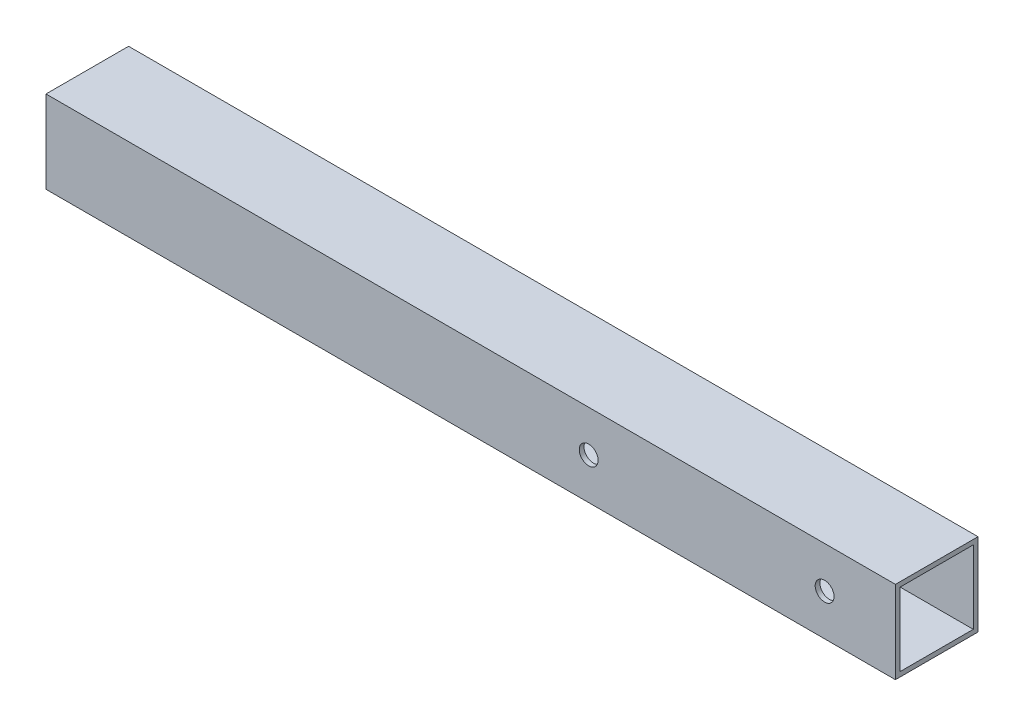
ISO-10303-21;
HEADER;
FILE_DESCRIPTION(('STEP AP214'),'2;1');
FILE_NAME('part.step','',(''),(''),'','','');
FILE_SCHEMA(('AUTOMOTIVE_DESIGN { 1 0 10303 214 1 1 1 1 }'));
ENDSEC;
DATA;
#1=APPLICATION_CONTEXT('core data for automotive mechanical design processes');
#2=APPLICATION_PROTOCOL_DEFINITION('international standard','automotive_design',2000,#1);
#3=PRODUCT_CONTEXT('',#1,'mechanical');
#4=PRODUCT('Part','Part','',(#3));
#5=PRODUCT_RELATED_PRODUCT_CATEGORY('part','',(#4));
#6=PRODUCT_DEFINITION_FORMATION('','',#4);
#7=PRODUCT_DEFINITION_CONTEXT('part definition',#1,'design');
#8=PRODUCT_DEFINITION('design','',#6,#7);
#9=PRODUCT_DEFINITION_SHAPE('','',#8);
#10=(LENGTH_UNIT() NAMED_UNIT(*) SI_UNIT(.MILLI.,.METRE.));
#11=(NAMED_UNIT(*) PLANE_ANGLE_UNIT() SI_UNIT($,.RADIAN.));
#12=(NAMED_UNIT(*) SI_UNIT($,.STERADIAN.) SOLID_ANGLE_UNIT());
#13=UNCERTAINTY_MEASURE_WITH_UNIT(LENGTH_MEASURE(1.E-05),#10,'distance_accuracy_value','');
#14=(GEOMETRIC_REPRESENTATION_CONTEXT(3) GLOBAL_UNCERTAINTY_ASSIGNED_CONTEXT((#13)) GLOBAL_UNIT_ASSIGNED_CONTEXT((#10,
#11,#12)) REPRESENTATION_CONTEXT('',''));
#15=CARTESIAN_POINT('',(0.,0.,0.));
#16=DIRECTION('',(0.,0.,1.));
#17=DIRECTION('',(1.,0.,0.));
#18=AXIS2_PLACEMENT_3D('',#15,#16,#17);
#19=CARTESIAN_POINT('',(360.,0.,0.));
#20=DIRECTION('',(-1.,0.,0.));
#21=DIRECTION('',(0.,0.,1.));
#22=AXIS2_PLACEMENT_3D('',#19,#20,#21);
#23=PLANE('',#22);
#24=DIRECTION('',(0.,-1.,0.));
#25=VECTOR('',#24,1.);
#26=CARTESIAN_POINT('',(360.,0.,0.));
#27=LINE('',#26,#25);
#28=CARTESIAN_POINT('',(360.,35.,0.));
#29=VERTEX_POINT('',#28);
#30=CARTESIAN_POINT('',(360.,0.,0.));
#31=VERTEX_POINT('',#30);
#32=EDGE_CURVE('E138',#29,#31,#27,.T.);
#33=ORIENTED_EDGE('',*,*,#32,.T.);
#34=DIRECTION('',(0.,0.,-1.));
#35=VECTOR('',#34,1.);
#36=CARTESIAN_POINT('',(360.,0.,0.));
#37=LINE('',#36,#35);
#38=CARTESIAN_POINT('',(360.,0.,-35.));
#39=VERTEX_POINT('',#38);
#40=EDGE_CURVE('E141',#31,#39,#37,.T.);
#41=ORIENTED_EDGE('',*,*,#40,.T.);
#42=DIRECTION('',(0.,1.,0.));
#43=VECTOR('',#42,1.);
#44=CARTESIAN_POINT('',(360.,0.,-35.));
#45=LINE('',#44,#43);
#46=CARTESIAN_POINT('',(360.,35.,-35.));
#47=VERTEX_POINT('',#46);
#48=EDGE_CURVE('E144',#39,#47,#45,.T.);
#49=ORIENTED_EDGE('',*,*,#48,.T.);
#50=DIRECTION('',(0.,0.,1.));
#51=VECTOR('',#50,1.);
#52=CARTESIAN_POINT('',(360.,35.,0.));
#53=LINE('',#52,#51);
#54=EDGE_CURVE('E146',#47,#29,#53,.T.);
#55=ORIENTED_EDGE('',*,*,#54,.T.);
#56=EDGE_LOOP('',(#33,#41,#49,#55));
#57=FACE_BOUND('',#56,.T.);
#58=DIRECTION('',(0.,-1.,0.));
#59=VECTOR('',#58,1.);
#60=CARTESIAN_POINT('',(360.,2.,-2.));
#61=LINE('',#60,#59);
#62=CARTESIAN_POINT('',(360.,33.,-2.));
#63=VERTEX_POINT('',#62);
#64=CARTESIAN_POINT('',(360.,2.,-2.));
#65=VERTEX_POINT('',#64);
#66=EDGE_CURVE('E100',#63,#65,#61,.T.);
#67=ORIENTED_EDGE('',*,*,#66,.F.);
#68=DIRECTION('',(0.,0.,1.));
#69=VECTOR('',#68,1.);
#70=CARTESIAN_POINT('',(360.,33.,-2.));
#71=LINE('',#70,#69);
#72=CARTESIAN_POINT('',(360.,33.,-33.));
#73=VERTEX_POINT('',#72);
#74=EDGE_CURVE('E122',#73,#63,#71,.T.);
#75=ORIENTED_EDGE('',*,*,#74,.F.);
#76=DIRECTION('',(0.,1.,0.));
#77=VECTOR('',#76,1.);
#78=CARTESIAN_POINT('',(360.,2.,-33.));
#79=LINE('',#78,#77);
#80=CARTESIAN_POINT('',(360.,2.,-33.));
#81=VERTEX_POINT('',#80);
#82=EDGE_CURVE('E120',#81,#73,#79,.T.);
#83=ORIENTED_EDGE('',*,*,#82,.F.);
#84=DIRECTION('',(0.,0.,-1.));
#85=VECTOR('',#84,1.);
#86=CARTESIAN_POINT('',(360.,2.,-2.));
#87=LINE('',#86,#85);
#88=EDGE_CURVE('E108',#65,#81,#87,.T.);
#89=ORIENTED_EDGE('',*,*,#88,.F.);
#90=EDGE_LOOP('',(#67,#75,#83,#89));
#91=FACE_BOUND('',#90,.T.);
#92=ADVANCED_FACE('F33',(#57,#91),#23,.F.);
#93=CARTESIAN_POINT('',(0.,0.,0.));
#94=DIRECTION('',(-1.,0.,0.));
#95=DIRECTION('',(0.,0.,1.));
#96=AXIS2_PLACEMENT_3D('',#93,#94,#95);
#97=PLANE('',#96);
#98=DIRECTION('',(0.,-1.,0.));
#99=VECTOR('',#98,1.);
#100=CARTESIAN_POINT('',(0.,0.,0.));
#101=LINE('',#100,#99);
#102=CARTESIAN_POINT('',(0.,35.,0.));
#103=VERTEX_POINT('',#102);
#104=CARTESIAN_POINT('',(0.,0.,0.));
#105=VERTEX_POINT('',#104);
#106=EDGE_CURVE('E116',#103,#105,#101,.T.);
#107=ORIENTED_EDGE('',*,*,#106,.F.);
#108=DIRECTION('',(0.,0.,1.));
#109=VECTOR('',#108,1.);
#110=CARTESIAN_POINT('',(0.,35.,0.));
#111=LINE('',#110,#109);
#112=CARTESIAN_POINT('',(0.,35.,-35.));
#113=VERTEX_POINT('',#112);
#114=EDGE_CURVE('E142',#113,#103,#111,.T.);
#115=ORIENTED_EDGE('',*,*,#114,.F.);
#116=DIRECTION('',(0.,1.,0.));
#117=VECTOR('',#116,1.);
#118=CARTESIAN_POINT('',(0.,0.,-35.));
#119=LINE('',#118,#117);
#120=CARTESIAN_POINT('',(0.,0.,-35.));
#121=VERTEX_POINT('',#120);
#122=EDGE_CURVE('E153',#121,#113,#119,.T.);
#123=ORIENTED_EDGE('',*,*,#122,.F.);
#124=DIRECTION('',(0.,0.,-1.));
#125=VECTOR('',#124,1.);
#126=CARTESIAN_POINT('',(0.,0.,0.));
#127=LINE('',#126,#125);
#128=EDGE_CURVE('E151',#105,#121,#127,.T.);
#129=ORIENTED_EDGE('',*,*,#128,.F.);
#130=EDGE_LOOP('',(#107,#115,#123,#129));
#131=FACE_BOUND('',#130,.T.);
#132=DIRECTION('',(0.,0.,1.));
#133=VECTOR('',#132,1.);
#134=CARTESIAN_POINT('',(0.,33.,-2.));
#135=LINE('',#134,#133);
#136=CARTESIAN_POINT('',(0.,33.,-33.));
#137=VERTEX_POINT('',#136);
#138=CARTESIAN_POINT('',(0.,33.,-2.));
#139=VERTEX_POINT('',#138);
#140=EDGE_CURVE('E109',#137,#139,#135,.T.);
#141=ORIENTED_EDGE('',*,*,#140,.T.);
#142=DIRECTION('',(0.,-1.,0.));
#143=VECTOR('',#142,1.);
#144=CARTESIAN_POINT('',(0.,2.,-2.));
#145=LINE('',#144,#143);
#146=CARTESIAN_POINT('',(0.,2.,-2.));
#147=VERTEX_POINT('',#146);
#148=EDGE_CURVE('E58',#139,#147,#145,.T.);
#149=ORIENTED_EDGE('',*,*,#148,.T.);
#150=DIRECTION('',(0.,0.,-1.));
#151=VECTOR('',#150,1.);
#152=CARTESIAN_POINT('',(0.,2.,-2.));
#153=LINE('',#152,#151);
#154=CARTESIAN_POINT('',(0.,2.,-33.));
#155=VERTEX_POINT('',#154);
#156=EDGE_CURVE('E115',#147,#155,#153,.T.);
#157=ORIENTED_EDGE('',*,*,#156,.T.);
#158=DIRECTION('',(0.,1.,0.));
#159=VECTOR('',#158,1.);
#160=CARTESIAN_POINT('',(0.,2.,-33.));
#161=LINE('',#160,#159);
#162=EDGE_CURVE('E130',#155,#137,#161,.T.);
#163=ORIENTED_EDGE('',*,*,#162,.T.);
#164=EDGE_LOOP('',(#141,#149,#157,#163));
#165=FACE_BOUND('',#164,.T.);
#166=ADVANCED_FACE('F200',(#131,#165),#97,.T.);
#167=CARTESIAN_POINT('',(360.,0.,0.));
#168=DIRECTION('',(0.,0.,-1.));
#169=DIRECTION('',(0.,1.,0.));
#170=AXIS2_PLACEMENT_3D('',#167,#168,#169);
#171=PLANE('',#170);
#172=CARTESIAN_POINT('',(330.,17.5,0.));
#173=DIRECTION('',(0.,0.,1.));
#174=DIRECTION('',(1.,0.,0.));
#175=AXIS2_PLACEMENT_3D('',#172,#173,#174);
#176=CIRCLE('',#175,3.99999999999999);
#177=CARTESIAN_POINT('',(334.,17.5,0.));
#178=VERTEX_POINT('',#177);
#179=EDGE_CURVE('E171',#178,#178,#176,.T.);
#180=ORIENTED_EDGE('',*,*,#179,.F.);
#181=EDGE_LOOP('',(#180));
#182=FACE_BOUND('',#181,.T.);
#183=CARTESIAN_POINT('',(230.,17.5,0.));
#184=DIRECTION('',(0.,0.,1.));
#185=DIRECTION('',(1.,0.,0.));
#186=AXIS2_PLACEMENT_3D('',#183,#184,#185);
#187=CIRCLE('',#186,3.99999999999999);
#188=CARTESIAN_POINT('',(234.,17.5,0.));
#189=VERTEX_POINT('',#188);
#190=EDGE_CURVE('E181',#189,#189,#187,.T.);
#191=ORIENTED_EDGE('',*,*,#190,.F.);
#192=EDGE_LOOP('',(#191));
#193=FACE_BOUND('',#192,.T.);
#194=ORIENTED_EDGE('',*,*,#106,.T.);
#195=DIRECTION('',(-1.,0.,0.));
#196=VECTOR('',#195,1.);
#197=CARTESIAN_POINT('',(360.,0.,0.));
#198=LINE('',#197,#196);
#199=EDGE_CURVE('E11',#31,#105,#198,.T.);
#200=ORIENTED_EDGE('',*,*,#199,.F.);
#201=ORIENTED_EDGE('',*,*,#32,.F.);
#202=DIRECTION('',(-1.,0.,0.));
#203=VECTOR('',#202,1.);
#204=CARTESIAN_POINT('',(360.,35.,0.));
#205=LINE('',#204,#203);
#206=EDGE_CURVE('E148',#29,#103,#205,.T.);
#207=ORIENTED_EDGE('',*,*,#206,.T.);
#208=EDGE_LOOP('',(#194,#200,#201,#207));
#209=FACE_BOUND('',#208,.T.);
#210=ADVANCED_FACE('F35',(#182,#193,#209),#171,.F.);
#211=CARTESIAN_POINT('',(360.,0.,0.));
#212=DIRECTION('',(0.,1.,0.));
#213=DIRECTION('',(0.,0.,1.));
#214=AXIS2_PLACEMENT_3D('',#211,#212,#213);
#215=PLANE('',#214);
#216=ORIENTED_EDGE('',*,*,#128,.T.);
#217=DIRECTION('',(-1.,0.,0.));
#218=VECTOR('',#217,1.);
#219=CARTESIAN_POINT('',(360.,0.,-35.));
#220=LINE('',#219,#218);
#221=EDGE_CURVE('E42',#39,#121,#220,.T.);
#222=ORIENTED_EDGE('',*,*,#221,.F.);
#223=ORIENTED_EDGE('',*,*,#40,.F.);
#224=ORIENTED_EDGE('',*,*,#199,.T.);
#225=EDGE_LOOP('',(#216,#222,#223,#224));
#226=FACE_BOUND('',#225,.T.);
#227=ADVANCED_FACE('F226',(#226),#215,.F.);
#228=CARTESIAN_POINT('',(360.,0.,-35.));
#229=DIRECTION('',(0.,0.,1.));
#230=DIRECTION('',(0.,-1.,0.));
#231=AXIS2_PLACEMENT_3D('',#228,#229,#230);
#232=PLANE('',#231);
#233=CARTESIAN_POINT('',(330.,17.5,-35.));
#234=DIRECTION('',(0.,0.,1.));
#235=DIRECTION('',(1.,0.,0.));
#236=AXIS2_PLACEMENT_3D('',#233,#234,#235);
#237=CIRCLE('',#236,3.99999999999999);
#238=CARTESIAN_POINT('',(334.,17.5,-35.));
#239=VERTEX_POINT('',#238);
#240=EDGE_CURVE('E165',#239,#239,#237,.T.);
#241=ORIENTED_EDGE('',*,*,#240,.T.);
#242=EDGE_LOOP('',(#241));
#243=FACE_BOUND('',#242,.T.);
#244=CARTESIAN_POINT('',(230.,17.5,-35.));
#245=DIRECTION('',(0.,0.,1.));
#246=DIRECTION('',(1.,0.,0.));
#247=AXIS2_PLACEMENT_3D('',#244,#245,#246);
#248=CIRCLE('',#247,3.99999999999999);
#249=CARTESIAN_POINT('',(234.,17.5,-35.));
#250=VERTEX_POINT('',#249);
#251=EDGE_CURVE('E176',#250,#250,#248,.T.);
#252=ORIENTED_EDGE('',*,*,#251,.T.);
#253=EDGE_LOOP('',(#252));
#254=FACE_BOUND('',#253,.T.);
#255=ORIENTED_EDGE('',*,*,#122,.T.);
#256=DIRECTION('',(-1.,0.,0.));
#257=VECTOR('',#256,1.);
#258=CARTESIAN_POINT('',(360.,35.,-35.));
#259=LINE('',#258,#257);
#260=EDGE_CURVE('E158',#47,#113,#259,.T.);
#261=ORIENTED_EDGE('',*,*,#260,.F.);
#262=ORIENTED_EDGE('',*,*,#48,.F.);
#263=ORIENTED_EDGE('',*,*,#221,.T.);
#264=EDGE_LOOP('',(#255,#261,#262,#263));
#265=FACE_BOUND('',#264,.T.);
#266=ADVANCED_FACE('F223',(#243,#254,#265),#232,.F.);
#267=CARTESIAN_POINT('',(360.,35.,0.));
#268=DIRECTION('',(0.,-1.,0.));
#269=DIRECTION('',(0.,0.,-1.));
#270=AXIS2_PLACEMENT_3D('',#267,#268,#269);
#271=PLANE('',#270);
#272=ORIENTED_EDGE('',*,*,#114,.T.);
#273=ORIENTED_EDGE('',*,*,#206,.F.);
#274=ORIENTED_EDGE('',*,*,#54,.F.);
#275=ORIENTED_EDGE('',*,*,#260,.T.);
#276=EDGE_LOOP('',(#272,#273,#274,#275));
#277=FACE_BOUND('',#276,.T.);
#278=ADVANCED_FACE('F220',(#277),#271,.F.);
#279=CARTESIAN_POINT('',(360.,2.,-2.));
#280=DIRECTION('',(0.,0.,-1.));
#281=DIRECTION('',(-1.,0.,0.));
#282=AXIS2_PLACEMENT_3D('',#279,#280,#281);
#283=PLANE('',#282);
#284=CARTESIAN_POINT('',(330.,17.5,-2.));
#285=DIRECTION('',(0.,0.,-1.));
#286=DIRECTION('',(-1.,0.,0.));
#287=AXIS2_PLACEMENT_3D('',#284,#285,#286);
#288=CIRCLE('',#287,3.99999999999999);
#289=CARTESIAN_POINT('',(326.,17.5,-2.));
#290=VERTEX_POINT('',#289);
#291=EDGE_CURVE('E128',#290,#290,#288,.T.);
#292=ORIENTED_EDGE('',*,*,#291,.F.);
#293=EDGE_LOOP('',(#292));
#294=FACE_BOUND('',#293,.T.);
#295=CARTESIAN_POINT('',(230.,17.5,-2.));
#296=DIRECTION('',(0.,0.,-1.));
#297=DIRECTION('',(-1.,0.,0.));
#298=AXIS2_PLACEMENT_3D('',#295,#296,#297);
#299=CIRCLE('',#298,3.99999999999999);
#300=CARTESIAN_POINT('',(226.,17.5,-2.));
#301=VERTEX_POINT('',#300);
#302=EDGE_CURVE('E164',#301,#301,#299,.T.);
#303=ORIENTED_EDGE('',*,*,#302,.F.);
#304=EDGE_LOOP('',(#303));
#305=FACE_BOUND('',#304,.T.);
#306=ORIENTED_EDGE('',*,*,#148,.F.);
#307=DIRECTION('',(-1.,0.,0.));
#308=VECTOR('',#307,1.);
#309=CARTESIAN_POINT('',(360.,33.,-2.));
#310=LINE('',#309,#308);
#311=EDGE_CURVE('E104',#63,#139,#310,.T.);
#312=ORIENTED_EDGE('',*,*,#311,.F.);
#313=ORIENTED_EDGE('',*,*,#66,.T.);
#314=DIRECTION('',(-1.,0.,0.));
#315=VECTOR('',#314,1.);
#316=CARTESIAN_POINT('',(360.,2.,-2.));
#317=LINE('',#316,#315);
#318=EDGE_CURVE('E103',#65,#147,#317,.T.);
#319=ORIENTED_EDGE('',*,*,#318,.T.);
#320=EDGE_LOOP('',(#306,#312,#313,#319));
#321=FACE_BOUND('',#320,.T.);
#322=ADVANCED_FACE('F102',(#294,#305,#321),#283,.T.);
#323=CARTESIAN_POINT('',(360.,2.,-2.));
#324=DIRECTION('',(0.,1.,0.));
#325=DIRECTION('',(0.,0.,1.));
#326=AXIS2_PLACEMENT_3D('',#323,#324,#325);
#327=PLANE('',#326);
#328=ORIENTED_EDGE('',*,*,#156,.F.);
#329=ORIENTED_EDGE('',*,*,#318,.F.);
#330=ORIENTED_EDGE('',*,*,#88,.T.);
#331=DIRECTION('',(-1.,0.,0.));
#332=VECTOR('',#331,1.);
#333=CARTESIAN_POINT('',(360.,2.,-33.));
#334=LINE('',#333,#332);
#335=EDGE_CURVE('E117',#81,#155,#334,.T.);
#336=ORIENTED_EDGE('',*,*,#335,.T.);
#337=EDGE_LOOP('',(#328,#329,#330,#336));
#338=FACE_BOUND('',#337,.T.);
#339=ADVANCED_FACE('F112',(#338),#327,.T.);
#340=CARTESIAN_POINT('',(360.,2.,-33.));
#341=DIRECTION('',(0.,0.,1.));
#342=DIRECTION('',(1.,0.,0.));
#343=AXIS2_PLACEMENT_3D('',#340,#341,#342);
#344=PLANE('',#343);
#345=CARTESIAN_POINT('',(330.,17.5,-33.));
#346=DIRECTION('',(0.,0.,1.));
#347=DIRECTION('',(1.,0.,0.));
#348=AXIS2_PLACEMENT_3D('',#345,#346,#347);
#349=CIRCLE('',#348,3.99999999999999);
#350=CARTESIAN_POINT('',(334.,17.5,-33.));
#351=VERTEX_POINT('',#350);
#352=EDGE_CURVE('E37',#351,#351,#349,.T.);
#353=ORIENTED_EDGE('',*,*,#352,.F.);
#354=EDGE_LOOP('',(#353));
#355=FACE_BOUND('',#354,.T.);
#356=CARTESIAN_POINT('',(230.,17.5,-33.));
#357=DIRECTION('',(0.,0.,1.));
#358=DIRECTION('',(1.,0.,0.));
#359=AXIS2_PLACEMENT_3D('',#356,#357,#358);
#360=CIRCLE('',#359,3.99999999999999);
#361=CARTESIAN_POINT('',(234.,17.5,-33.));
#362=VERTEX_POINT('',#361);
#363=EDGE_CURVE('E162',#362,#362,#360,.T.);
#364=ORIENTED_EDGE('',*,*,#363,.F.);
#365=EDGE_LOOP('',(#364));
#366=FACE_BOUND('',#365,.T.);
#367=ORIENTED_EDGE('',*,*,#162,.F.);
#368=ORIENTED_EDGE('',*,*,#335,.F.);
#369=ORIENTED_EDGE('',*,*,#82,.T.);
#370=DIRECTION('',(-1.,0.,0.));
#371=VECTOR('',#370,1.);
#372=CARTESIAN_POINT('',(360.,33.,-33.));
#373=LINE('',#372,#371);
#374=EDGE_CURVE('E50',#73,#137,#373,.T.);
#375=ORIENTED_EDGE('',*,*,#374,.T.);
#376=EDGE_LOOP('',(#367,#368,#369,#375));
#377=FACE_BOUND('',#376,.T.);
#378=ADVANCED_FACE('F192',(#355,#366,#377),#344,.T.);
#379=CARTESIAN_POINT('',(360.,33.,-2.));
#380=DIRECTION('',(0.,-1.,0.));
#381=DIRECTION('',(0.,0.,-1.));
#382=AXIS2_PLACEMENT_3D('',#379,#380,#381);
#383=PLANE('',#382);
#384=ORIENTED_EDGE('',*,*,#140,.F.);
#385=ORIENTED_EDGE('',*,*,#374,.F.);
#386=ORIENTED_EDGE('',*,*,#74,.T.);
#387=ORIENTED_EDGE('',*,*,#311,.T.);
#388=EDGE_LOOP('',(#384,#385,#386,#387));
#389=FACE_BOUND('',#388,.T.);
#390=ADVANCED_FACE('F195',(#389),#383,.T.);
#391=CARTESIAN_POINT('',(230.,17.5,-35.));
#392=DIRECTION('',(0.,0.,1.));
#393=DIRECTION('',(1.,0.,0.));
#394=AXIS2_PLACEMENT_3D('',#391,#392,#393);
#395=CYLINDRICAL_SURFACE('',#394,3.99999999999999);
#396=ORIENTED_EDGE('',*,*,#363,.T.);
#397=EDGE_LOOP('',(#396));
#398=FACE_BOUND('',#397,.T.);
#399=ORIENTED_EDGE('',*,*,#251,.F.);
#400=EDGE_LOOP('',(#399));
#401=FACE_BOUND('',#400,.T.);
#402=ADVANCED_FACE('F202',(#398,#401),#395,.F.);
#403=CARTESIAN_POINT('',(330.,17.5,-35.));
#404=DIRECTION('',(0.,0.,1.));
#405=DIRECTION('',(1.,0.,0.));
#406=AXIS2_PLACEMENT_3D('',#403,#404,#405);
#407=CYLINDRICAL_SURFACE('',#406,3.99999999999999);
#408=ORIENTED_EDGE('',*,*,#352,.T.);
#409=EDGE_LOOP('',(#408));
#410=FACE_BOUND('',#409,.T.);
#411=ORIENTED_EDGE('',*,*,#240,.F.);
#412=EDGE_LOOP('',(#411));
#413=FACE_BOUND('',#412,.T.);
#414=ADVANCED_FACE('F189',(#410,#413),#407,.F.);
#415=ORIENTED_EDGE('',*,*,#302,.T.);
#416=EDGE_LOOP('',(#415));
#417=FACE_BOUND('',#416,.T.);
#418=ORIENTED_EDGE('',*,*,#190,.T.);
#419=EDGE_LOOP('',(#418));
#420=FACE_BOUND('',#419,.T.);
#421=ADVANCED_FACE('F208',(#417,#420),#395,.F.);
#422=ORIENTED_EDGE('',*,*,#291,.T.);
#423=EDGE_LOOP('',(#422));
#424=FACE_BOUND('',#423,.T.);
#425=ORIENTED_EDGE('',*,*,#179,.T.);
#426=EDGE_LOOP('',(#425));
#427=FACE_BOUND('',#426,.T.);
#428=ADVANCED_FACE('F252',(#424,#427),#407,.F.);
#429=CLOSED_SHELL('',(#92,#166,#210,#227,#266,#278,#322,#339,#378,#390,#402,#414,#421,#428));
#430=MANIFOLD_SOLID_BREP('B2',#429);
#431=ADVANCED_BREP_SHAPE_REPRESENTATION('',(#18,#430),#14);
#432=SHAPE_DEFINITION_REPRESENTATION(#9,#431);
ENDSEC;
END-ISO-10303-21;
